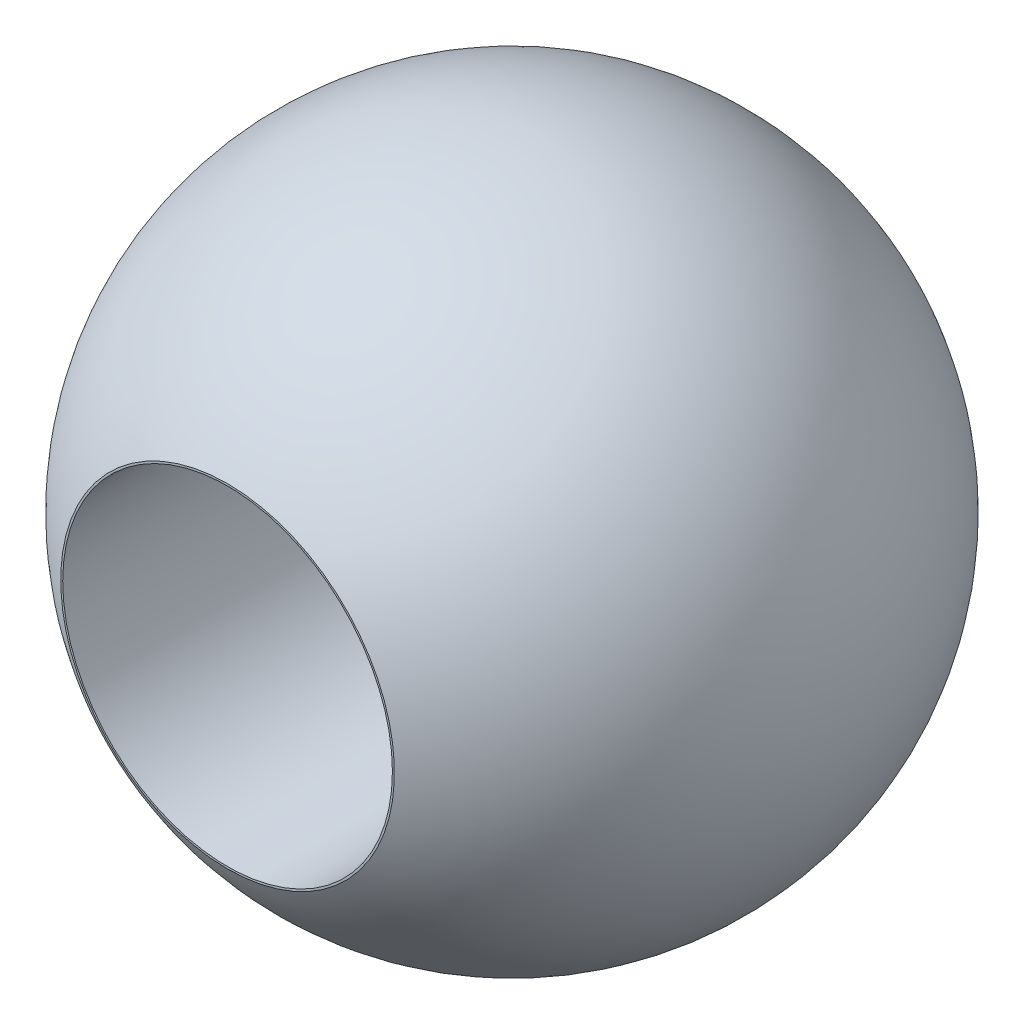
ISO-10303-21;
HEADER;
FILE_DESCRIPTION(('STEP AP214'),'2;1');
FILE_NAME('part.step','',(''),(''),'','','');
FILE_SCHEMA(('AUTOMOTIVE_DESIGN { 1 0 10303 214 1 1 1 1 }'));
ENDSEC;
DATA;
#1=APPLICATION_CONTEXT('core data for automotive mechanical design processes');
#2=APPLICATION_PROTOCOL_DEFINITION('international standard','automotive_design',2000,#1);
#3=PRODUCT_CONTEXT('',#1,'mechanical');
#4=PRODUCT('Part','Part','',(#3));
#5=PRODUCT_RELATED_PRODUCT_CATEGORY('part','',(#4));
#6=PRODUCT_DEFINITION_FORMATION('','',#4);
#7=PRODUCT_DEFINITION_CONTEXT('part definition',#1,'design');
#8=PRODUCT_DEFINITION('design','',#6,#7);
#9=PRODUCT_DEFINITION_SHAPE('','',#8);
#10=(LENGTH_UNIT() NAMED_UNIT(*) SI_UNIT(.MILLI.,.METRE.));
#11=(NAMED_UNIT(*) PLANE_ANGLE_UNIT() SI_UNIT($,.RADIAN.));
#12=(NAMED_UNIT(*) SI_UNIT($,.STERADIAN.) SOLID_ANGLE_UNIT());
#13=UNCERTAINTY_MEASURE_WITH_UNIT(LENGTH_MEASURE(1.E-05),#10,'distance_accuracy_value','');
#14=(GEOMETRIC_REPRESENTATION_CONTEXT(3) GLOBAL_UNCERTAINTY_ASSIGNED_CONTEXT((#13)) GLOBAL_UNIT_ASSIGNED_CONTEXT((#10,
#11,#12)) REPRESENTATION_CONTEXT('',''));
#15=CARTESIAN_POINT('',(0.,0.,0.));
#16=DIRECTION('',(0.,0.,1.));
#17=DIRECTION('',(1.,0.,0.));
#18=AXIS2_PLACEMENT_3D('',#15,#16,#17);
#19=CARTESIAN_POINT('',(0.,11.,0.));
#20=DIRECTION('',(0.,-1.,0.));
#21=DIRECTION('',(1.,0.,0.));
#22=AXIS2_PLACEMENT_3D('',#19,#20,#21);
#23=SPHERICAL_SURFACE('',#22,4.);
#24=CARTESIAN_POINT('',(0.,11.,0.));
#25=DIRECTION('',(0.,0.,1.));
#26=DIRECTION('',(0.,-1.,0.));
#27=AXIS2_PLACEMENT_3D('',#24,#25,#26);
#28=SPHERICAL_SURFACE('',#27,4.);
#29=CARTESIAN_POINT('',(0.,11.,-3.45));
#30=DIRECTION('',(0.,0.,1.));
#31=DIRECTION('',(0.,-1.,0.));
#32=AXIS2_PLACEMENT_3D('',#29,#30,#31);
#33=CIRCLE('',#32,2.02422824799971);
#34=CARTESIAN_POINT('',(0.,8.97577175200029,-3.45));
#35=VERTEX_POINT('',#34);
#36=EDGE_CURVE('E44',#35,#35,#33,.F.);
#37=ORIENTED_EDGE('',*,*,#36,.F.);
#38=EDGE_LOOP('',(#37));
#39=FACE_BOUND('',#38,.T.);
#40=CARTESIAN_POINT('',(0.,11.,3.45));
#41=DIRECTION('',(0.,0.,-1.));
#42=DIRECTION('',(0.,1.,0.));
#43=AXIS2_PLACEMENT_3D('',#40,#41,#42);
#44=CIRCLE('',#43,2.02422824799971);
#45=CARTESIAN_POINT('',(0.,13.0242282479997,3.45));
#46=VERTEX_POINT('',#45);
#47=EDGE_CURVE('E11',#46,#46,#44,.F.);
#48=ORIENTED_EDGE('',*,*,#47,.F.);
#49=EDGE_LOOP('',(#48));
#50=FACE_BOUND('',#49,.T.);
#51=ADVANCED_FACE('F41',(#39,#50),#28,.T.);
#52=CARTESIAN_POINT('',(-5.50000000000001,16.5,3.45));
#53=DIRECTION('',(0.,0.,-1.));
#54=DIRECTION('',(0.,1.,0.));
#55=AXIS2_PLACEMENT_3D('',#52,#53,#54);
#56=PLANE('',#55);
#57=CARTESIAN_POINT('',(0.,11.,3.45));
#58=DIRECTION('',(0.,0.,1.));
#59=DIRECTION('',(1.,0.,0.));
#60=AXIS2_PLACEMENT_3D('',#57,#58,#59);
#61=CIRCLE('',#60,2.);
#62=CARTESIAN_POINT('',(1.99999999999999,11.,3.45));
#63=VERTEX_POINT('',#62);
#64=EDGE_CURVE('E58',#63,#63,#61,.T.);
#65=ORIENTED_EDGE('',*,*,#64,.F.);
#66=EDGE_LOOP('',(#65));
#67=FACE_BOUND('',#66,.T.);
#68=ORIENTED_EDGE('',*,*,#47,.T.);
#69=EDGE_LOOP('',(#68));
#70=FACE_BOUND('',#69,.T.);
#71=ADVANCED_FACE('F65',(#67,#70),#56,.F.);
#72=CARTESIAN_POINT('',(-5.50000000000001,16.5,-3.45));
#73=DIRECTION('',(0.,0.,1.));
#74=DIRECTION('',(0.,-1.,0.));
#75=AXIS2_PLACEMENT_3D('',#72,#73,#74);
#76=PLANE('',#75);
#77=CARTESIAN_POINT('',(0.,11.,-3.45));
#78=DIRECTION('',(0.,0.,1.));
#79=DIRECTION('',(1.,0.,0.));
#80=AXIS2_PLACEMENT_3D('',#77,#78,#79);
#81=CIRCLE('',#80,2.);
#82=CARTESIAN_POINT('',(1.99999999999999,11.,-3.45));
#83=VERTEX_POINT('',#82);
#84=EDGE_CURVE('E53',#83,#83,#81,.T.);
#85=ORIENTED_EDGE('',*,*,#84,.T.);
#86=EDGE_LOOP('',(#85));
#87=FACE_BOUND('',#86,.T.);
#88=ORIENTED_EDGE('',*,*,#36,.T.);
#89=EDGE_LOOP('',(#88));
#90=FACE_BOUND('',#89,.T.);
#91=ADVANCED_FACE('F67',(#87,#90),#76,.F.);
#92=CARTESIAN_POINT('',(0.,11.,-3.45));
#93=DIRECTION('',(0.,0.,1.));
#94=DIRECTION('',(1.,0.,0.));
#95=AXIS2_PLACEMENT_3D('',#92,#93,#94);
#96=CYLINDRICAL_SURFACE('',#95,2.);
#97=ORIENTED_EDGE('',*,*,#84,.F.);
#98=EDGE_LOOP('',(#97));
#99=FACE_BOUND('',#98,.T.);
#100=ORIENTED_EDGE('',*,*,#64,.T.);
#101=EDGE_LOOP('',(#100));
#102=FACE_BOUND('',#101,.T.);
#103=ADVANCED_FACE('F63',(#99,#102),#96,.F.);
#104=CLOSED_SHELL('',(#51,#71,#91,#103));
#105=MANIFOLD_SOLID_BREP('B2',#104);
#106=ADVANCED_BREP_SHAPE_REPRESENTATION('',(#18,#105),#14);
#107=SHAPE_DEFINITION_REPRESENTATION(#9,#106);
ENDSEC;
END-ISO-10303-21;
